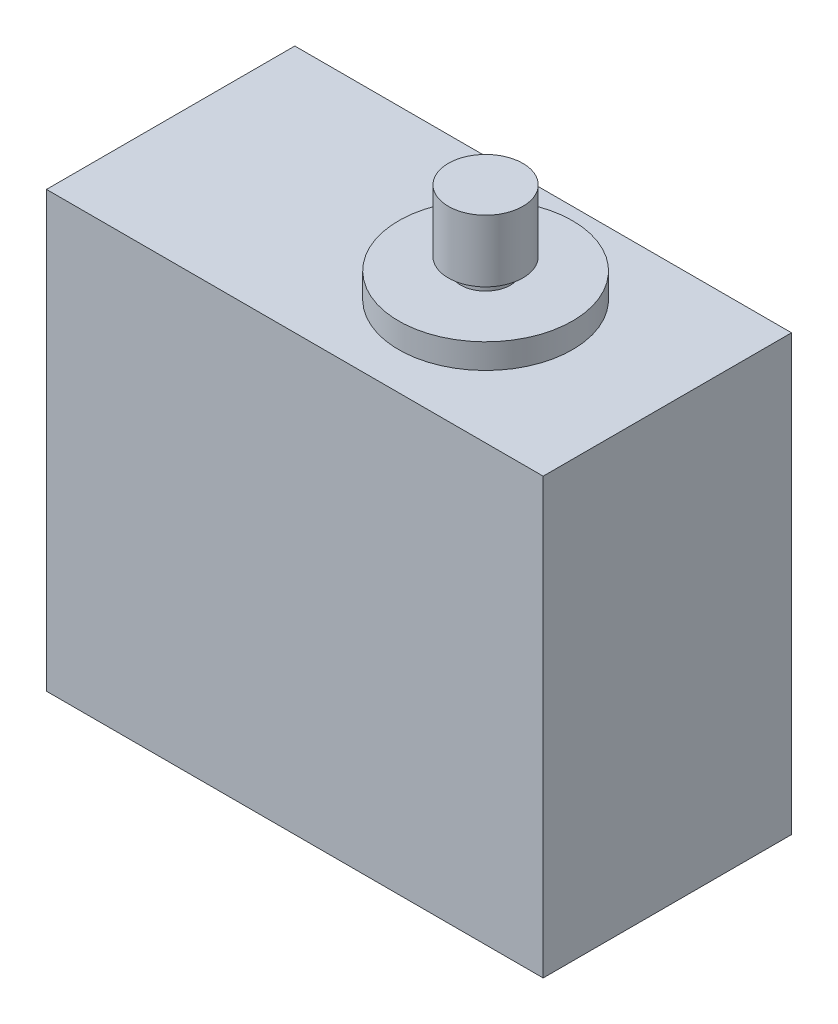
ISO-10303-21;
HEADER;
FILE_DESCRIPTION(('STEP AP214'),'2;1');
FILE_NAME('part.step','',(''),(''),'','','');
FILE_SCHEMA(('AUTOMOTIVE_DESIGN { 1 0 10303 214 1 1 1 1 }'));
ENDSEC;
DATA;
#1=APPLICATION_CONTEXT('core data for automotive mechanical design processes');
#2=APPLICATION_PROTOCOL_DEFINITION('international standard','automotive_design',2000,#1);
#3=PRODUCT_CONTEXT('',#1,'mechanical');
#4=PRODUCT('Part','Part','',(#3));
#5=PRODUCT_RELATED_PRODUCT_CATEGORY('part','',(#4));
#6=PRODUCT_DEFINITION_FORMATION('','',#4);
#7=PRODUCT_DEFINITION_CONTEXT('part definition',#1,'design');
#8=PRODUCT_DEFINITION('design','',#6,#7);
#9=PRODUCT_DEFINITION_SHAPE('','',#8);
#10=(LENGTH_UNIT() NAMED_UNIT(*) SI_UNIT(.MILLI.,.METRE.));
#11=(NAMED_UNIT(*) PLANE_ANGLE_UNIT() SI_UNIT($,.RADIAN.));
#12=(NAMED_UNIT(*) SI_UNIT($,.STERADIAN.) SOLID_ANGLE_UNIT());
#13=UNCERTAINTY_MEASURE_WITH_UNIT(LENGTH_MEASURE(1.E-05),#10,'distance_accuracy_value','');
#14=(GEOMETRIC_REPRESENTATION_CONTEXT(3) GLOBAL_UNCERTAINTY_ASSIGNED_CONTEXT((#13)) GLOBAL_UNIT_ASSIGNED_CONTEXT((#10,
#11,#12)) REPRESENTATION_CONTEXT('',''));
#15=CARTESIAN_POINT('',(0.,0.,0.));
#16=DIRECTION('',(0.,0.,1.));
#17=DIRECTION('',(1.,0.,0.));
#18=AXIS2_PLACEMENT_3D('',#15,#16,#17);
#19=CARTESIAN_POINT('',(0.,0.,10.));
#20=DIRECTION('',(1.,0.,0.));
#21=DIRECTION('',(0.,0.,-1.));
#22=AXIS2_PLACEMENT_3D('',#19,#20,#21);
#23=PLANE('',#22);
#24=DIRECTION('',(0.,-1.,0.));
#25=VECTOR('',#24,1.);
#26=CARTESIAN_POINT('',(0.,0.,-10.));
#27=LINE('',#26,#25);
#28=CARTESIAN_POINT('',(0.,35.,-10.));
#29=VERTEX_POINT('',#28);
#30=CARTESIAN_POINT('',(0.,0.,-10.));
#31=VERTEX_POINT('',#30);
#32=EDGE_CURVE('E103',#29,#31,#27,.T.);
#33=ORIENTED_EDGE('',*,*,#32,.T.);
#34=DIRECTION('',(0.,0.,-1.));
#35=VECTOR('',#34,1.);
#36=CARTESIAN_POINT('',(0.,0.,10.));
#37=LINE('',#36,#35);
#38=CARTESIAN_POINT('',(0.,0.,10.));
#39=VERTEX_POINT('',#38);
#40=EDGE_CURVE('E11',#39,#31,#37,.T.);
#41=ORIENTED_EDGE('',*,*,#40,.F.);
#42=DIRECTION('',(0.,-1.,0.));
#43=VECTOR('',#42,1.);
#44=CARTESIAN_POINT('',(0.,0.,10.));
#45=LINE('',#44,#43);
#46=CARTESIAN_POINT('',(0.,35.,10.));
#47=VERTEX_POINT('',#46);
#48=EDGE_CURVE('E91',#47,#39,#45,.T.);
#49=ORIENTED_EDGE('',*,*,#48,.F.);
#50=DIRECTION('',(0.,0.,-1.));
#51=VECTOR('',#50,1.);
#52=CARTESIAN_POINT('',(0.,35.,10.));
#53=LINE('',#52,#51);
#54=EDGE_CURVE('E99',#47,#29,#53,.T.);
#55=ORIENTED_EDGE('',*,*,#54,.T.);
#56=EDGE_LOOP('',(#33,#41,#49,#55));
#57=FACE_BOUND('',#56,.T.);
#58=ADVANCED_FACE('F40',(#57),#23,.F.);
#59=CARTESIAN_POINT('',(0.,0.,10.));
#60=DIRECTION('',(0.,1.,0.));
#61=DIRECTION('',(0.,0.,1.));
#62=AXIS2_PLACEMENT_3D('',#59,#60,#61);
#63=PLANE('',#62);
#64=DIRECTION('',(1.,0.,0.));
#65=VECTOR('',#64,1.);
#66=CARTESIAN_POINT('',(0.,0.,-10.));
#67=LINE('',#66,#65);
#68=CARTESIAN_POINT('',(40.,0.,-10.));
#69=VERTEX_POINT('',#68);
#70=EDGE_CURVE('E95',#31,#69,#67,.T.);
#71=ORIENTED_EDGE('',*,*,#70,.T.);
#72=DIRECTION('',(0.,0.,-1.));
#73=VECTOR('',#72,1.);
#74=CARTESIAN_POINT('',(40.,0.,10.));
#75=LINE('',#74,#73);
#76=CARTESIAN_POINT('',(40.,0.,10.));
#77=VERTEX_POINT('',#76);
#78=EDGE_CURVE('E48',#77,#69,#75,.T.);
#79=ORIENTED_EDGE('',*,*,#78,.F.);
#80=DIRECTION('',(1.,0.,0.));
#81=VECTOR('',#80,1.);
#82=CARTESIAN_POINT('',(0.,0.,10.));
#83=LINE('',#82,#81);
#84=EDGE_CURVE('E86',#39,#77,#83,.T.);
#85=ORIENTED_EDGE('',*,*,#84,.F.);
#86=ORIENTED_EDGE('',*,*,#40,.T.);
#87=EDGE_LOOP('',(#71,#79,#85,#86));
#88=FACE_BOUND('',#87,.T.);
#89=ADVANCED_FACE('F94',(#88),#63,.F.);
#90=CARTESIAN_POINT('',(40.,0.,10.));
#91=DIRECTION('',(-1.,0.,0.));
#92=DIRECTION('',(0.,0.,1.));
#93=AXIS2_PLACEMENT_3D('',#90,#91,#92);
#94=PLANE('',#93);
#95=DIRECTION('',(0.,1.,0.));
#96=VECTOR('',#95,1.);
#97=CARTESIAN_POINT('',(40.,0.,-10.));
#98=LINE('',#97,#96);
#99=CARTESIAN_POINT('',(40.,35.,-10.));
#100=VERTEX_POINT('',#99);
#101=EDGE_CURVE('E73',#69,#100,#98,.T.);
#102=ORIENTED_EDGE('',*,*,#101,.T.);
#103=DIRECTION('',(0.,0.,-1.));
#104=VECTOR('',#103,1.);
#105=CARTESIAN_POINT('',(40.,35.,10.));
#106=LINE('',#105,#104);
#107=CARTESIAN_POINT('',(40.,35.,10.));
#108=VERTEX_POINT('',#107);
#109=EDGE_CURVE('E96',#108,#100,#106,.T.);
#110=ORIENTED_EDGE('',*,*,#109,.F.);
#111=DIRECTION('',(0.,1.,0.));
#112=VECTOR('',#111,1.);
#113=CARTESIAN_POINT('',(40.,0.,10.));
#114=LINE('',#113,#112);
#115=EDGE_CURVE('E89',#77,#108,#114,.T.);
#116=ORIENTED_EDGE('',*,*,#115,.F.);
#117=ORIENTED_EDGE('',*,*,#78,.T.);
#118=EDGE_LOOP('',(#102,#110,#116,#117));
#119=FACE_BOUND('',#118,.T.);
#120=ADVANCED_FACE('F97',(#119),#94,.F.);
#121=CARTESIAN_POINT('',(0.,35.,10.));
#122=DIRECTION('',(0.,-1.,0.));
#123=DIRECTION('',(0.,0.,-1.));
#124=AXIS2_PLACEMENT_3D('',#121,#122,#123);
#125=PLANE('',#124);
#126=CARTESIAN_POINT('',(25.3642480343897,35.,0.));
#127=DIRECTION('',(0.,-1.,0.));
#128=DIRECTION('',(0.,0.,-1.));
#129=AXIS2_PLACEMENT_3D('',#126,#127,#128);
#130=CIRCLE('',#129,7.);
#131=CARTESIAN_POINT('',(25.3642480343897,35.,-7.));
#132=VERTEX_POINT('',#131);
#133=EDGE_CURVE('E131',#132,#132,#130,.T.);
#134=ORIENTED_EDGE('',*,*,#133,.T.);
#135=EDGE_LOOP('',(#134));
#136=FACE_BOUND('',#135,.T.);
#137=DIRECTION('',(-1.,0.,0.));
#138=VECTOR('',#137,1.);
#139=CARTESIAN_POINT('',(0.,35.,-10.));
#140=LINE('',#139,#138);
#141=EDGE_CURVE('E79',#100,#29,#140,.T.);
#142=ORIENTED_EDGE('',*,*,#141,.T.);
#143=ORIENTED_EDGE('',*,*,#54,.F.);
#144=DIRECTION('',(-1.,0.,0.));
#145=VECTOR('',#144,1.);
#146=CARTESIAN_POINT('',(0.,35.,10.));
#147=LINE('',#146,#145);
#148=EDGE_CURVE('E56',#108,#47,#147,.T.);
#149=ORIENTED_EDGE('',*,*,#148,.F.);
#150=ORIENTED_EDGE('',*,*,#109,.T.);
#151=EDGE_LOOP('',(#142,#143,#149,#150));
#152=FACE_BOUND('',#151,.T.);
#153=ADVANCED_FACE('F111',(#136,#152),#125,.F.);
#154=CARTESIAN_POINT('',(0.,0.,10.));
#155=DIRECTION('',(0.,0.,-1.));
#156=DIRECTION('',(-1.,0.,0.));
#157=AXIS2_PLACEMENT_3D('',#154,#155,#156);
#158=PLANE('',#157);
#159=ORIENTED_EDGE('',*,*,#48,.T.);
#160=ORIENTED_EDGE('',*,*,#84,.T.);
#161=ORIENTED_EDGE('',*,*,#115,.T.);
#162=ORIENTED_EDGE('',*,*,#148,.T.);
#163=EDGE_LOOP('',(#159,#160,#161,#162));
#164=FACE_BOUND('',#163,.T.);
#165=ADVANCED_FACE('F87',(#164),#158,.F.);
#166=CARTESIAN_POINT('',(0.,0.,-10.));
#167=DIRECTION('',(0.,0.,-1.));
#168=DIRECTION('',(-1.,0.,0.));
#169=AXIS2_PLACEMENT_3D('',#166,#167,#168);
#170=PLANE('',#169);
#171=ORIENTED_EDGE('',*,*,#32,.F.);
#172=ORIENTED_EDGE('',*,*,#141,.F.);
#173=ORIENTED_EDGE('',*,*,#101,.F.);
#174=ORIENTED_EDGE('',*,*,#70,.F.);
#175=EDGE_LOOP('',(#171,#172,#173,#174));
#176=FACE_BOUND('',#175,.T.);
#177=ADVANCED_FACE('F114',(#176),#170,.T.);
#178=CARTESIAN_POINT('',(25.3642480343897,43.,0.));
#179=DIRECTION('',(0.,-1.,0.));
#180=DIRECTION('',(0.,0.,-1.));
#181=AXIS2_PLACEMENT_3D('',#178,#179,#180);
#182=PLANE('',#181);
#183=CARTESIAN_POINT('',(25.3642480343897,43.,0.));
#184=DIRECTION('',(0.,-1.,0.));
#185=DIRECTION('',(0.,0.,-1.));
#186=AXIS2_PLACEMENT_3D('',#183,#184,#185);
#187=CIRCLE('',#186,3.);
#188=CARTESIAN_POINT('',(25.3642480343897,43.,-3.));
#189=VERTEX_POINT('',#188);
#190=EDGE_CURVE('E106',#189,#189,#187,.T.);
#191=ORIENTED_EDGE('',*,*,#190,.F.);
#192=EDGE_LOOP('',(#191));
#193=FACE_BOUND('',#192,.T.);
#194=ADVANCED_FACE('F163',(#193),#182,.F.);
#195=CARTESIAN_POINT('',(25.3642480343897,35.,0.));
#196=DIRECTION('',(0.,-1.,0.));
#197=DIRECTION('',(0.,0.,-1.));
#198=AXIS2_PLACEMENT_3D('',#195,#196,#197);
#199=CYLINDRICAL_SURFACE('',#198,3.);
#200=CARTESIAN_POINT('',(25.3642480343897,38.,0.));
#201=DIRECTION('',(0.,-1.,0.));
#202=DIRECTION('',(0.,0.,-1.));
#203=AXIS2_PLACEMENT_3D('',#200,#201,#202);
#204=CIRCLE('',#203,3.);
#205=CARTESIAN_POINT('',(25.3642480343897,38.,-3.));
#206=VERTEX_POINT('',#205);
#207=EDGE_CURVE('E119',#206,#206,#204,.T.);
#208=ORIENTED_EDGE('',*,*,#207,.F.);
#209=EDGE_LOOP('',(#208));
#210=FACE_BOUND('',#209,.T.);
#211=ORIENTED_EDGE('',*,*,#190,.T.);
#212=EDGE_LOOP('',(#211));
#213=FACE_BOUND('',#212,.T.);
#214=ADVANCED_FACE('F157',(#210,#213),#199,.T.);
#215=CARTESIAN_POINT('',(22.3642480343897,38.,0.));
#216=DIRECTION('',(0.,1.,0.));
#217=DIRECTION('',(0.,0.,1.));
#218=AXIS2_PLACEMENT_3D('',#215,#216,#217);
#219=PLANE('',#218);
#220=CARTESIAN_POINT('',(25.3642480343897,38.,0.));
#221=DIRECTION('',(0.,-1.,0.));
#222=DIRECTION('',(0.,0.,-1.));
#223=AXIS2_PLACEMENT_3D('',#220,#221,#222);
#224=CIRCLE('',#223,2.);
#225=CARTESIAN_POINT('',(25.3642480343897,38.,-2.));
#226=VERTEX_POINT('',#225);
#227=EDGE_CURVE('E122',#226,#226,#224,.T.);
#228=ORIENTED_EDGE('',*,*,#227,.F.);
#229=EDGE_LOOP('',(#228));
#230=FACE_BOUND('',#229,.T.);
#231=ORIENTED_EDGE('',*,*,#207,.T.);
#232=EDGE_LOOP('',(#231));
#233=FACE_BOUND('',#232,.T.);
#234=ADVANCED_FACE('F151',(#230,#233),#219,.F.);
#235=CARTESIAN_POINT('',(25.3642480343897,35.,0.));
#236=DIRECTION('',(0.,-1.,0.));
#237=DIRECTION('',(0.,0.,-1.));
#238=AXIS2_PLACEMENT_3D('',#235,#236,#237);
#239=CYLINDRICAL_SURFACE('',#238,2.);
#240=CARTESIAN_POINT('',(25.3642480343897,37.,0.));
#241=DIRECTION('',(0.,-1.,0.));
#242=DIRECTION('',(0.,0.,-1.));
#243=AXIS2_PLACEMENT_3D('',#240,#241,#242);
#244=CIRCLE('',#243,2.);
#245=CARTESIAN_POINT('',(25.3642480343897,37.,-2.));
#246=VERTEX_POINT('',#245);
#247=EDGE_CURVE('E125',#246,#246,#244,.T.);
#248=ORIENTED_EDGE('',*,*,#247,.F.);
#249=EDGE_LOOP('',(#248));
#250=FACE_BOUND('',#249,.T.);
#251=ORIENTED_EDGE('',*,*,#227,.T.);
#252=EDGE_LOOP('',(#251));
#253=FACE_BOUND('',#252,.T.);
#254=ADVANCED_FACE('F145',(#250,#253),#239,.T.);
#255=CARTESIAN_POINT('',(23.3642480343897,37.,0.));
#256=DIRECTION('',(0.,-1.,0.));
#257=DIRECTION('',(0.,0.,-1.));
#258=AXIS2_PLACEMENT_3D('',#255,#256,#257);
#259=PLANE('',#258);
#260=CARTESIAN_POINT('',(25.3642480343897,37.,0.));
#261=DIRECTION('',(0.,-1.,0.));
#262=DIRECTION('',(0.,0.,-1.));
#263=AXIS2_PLACEMENT_3D('',#260,#261,#262);
#264=CIRCLE('',#263,7.);
#265=CARTESIAN_POINT('',(25.3642480343897,37.,-7.));
#266=VERTEX_POINT('',#265);
#267=EDGE_CURVE('E128',#266,#266,#264,.T.);
#268=ORIENTED_EDGE('',*,*,#267,.F.);
#269=EDGE_LOOP('',(#268));
#270=FACE_BOUND('',#269,.T.);
#271=ORIENTED_EDGE('',*,*,#247,.T.);
#272=EDGE_LOOP('',(#271));
#273=FACE_BOUND('',#272,.T.);
#274=ADVANCED_FACE('F139',(#270,#273),#259,.F.);
#275=CARTESIAN_POINT('',(25.3642480343897,35.,0.));
#276=DIRECTION('',(0.,-1.,0.));
#277=DIRECTION('',(0.,0.,-1.));
#278=AXIS2_PLACEMENT_3D('',#275,#276,#277);
#279=CYLINDRICAL_SURFACE('',#278,7.);
#280=ORIENTED_EDGE('',*,*,#133,.F.);
#281=EDGE_LOOP('',(#280));
#282=FACE_BOUND('',#281,.T.);
#283=ORIENTED_EDGE('',*,*,#267,.T.);
#284=EDGE_LOOP('',(#283));
#285=FACE_BOUND('',#284,.T.);
#286=ADVANCED_FACE('F136',(#282,#285),#279,.T.);
#287=CLOSED_SHELL('',(#58,#89,#120,#153,#165,#177,#194,#214,#234,#254,#274,#286));
#288=MANIFOLD_SOLID_BREP('B2',#287);
#289=ADVANCED_BREP_SHAPE_REPRESENTATION('',(#18,#288),#14);
#290=SHAPE_DEFINITION_REPRESENTATION(#9,#289);
ENDSEC;
END-ISO-10303-21;
